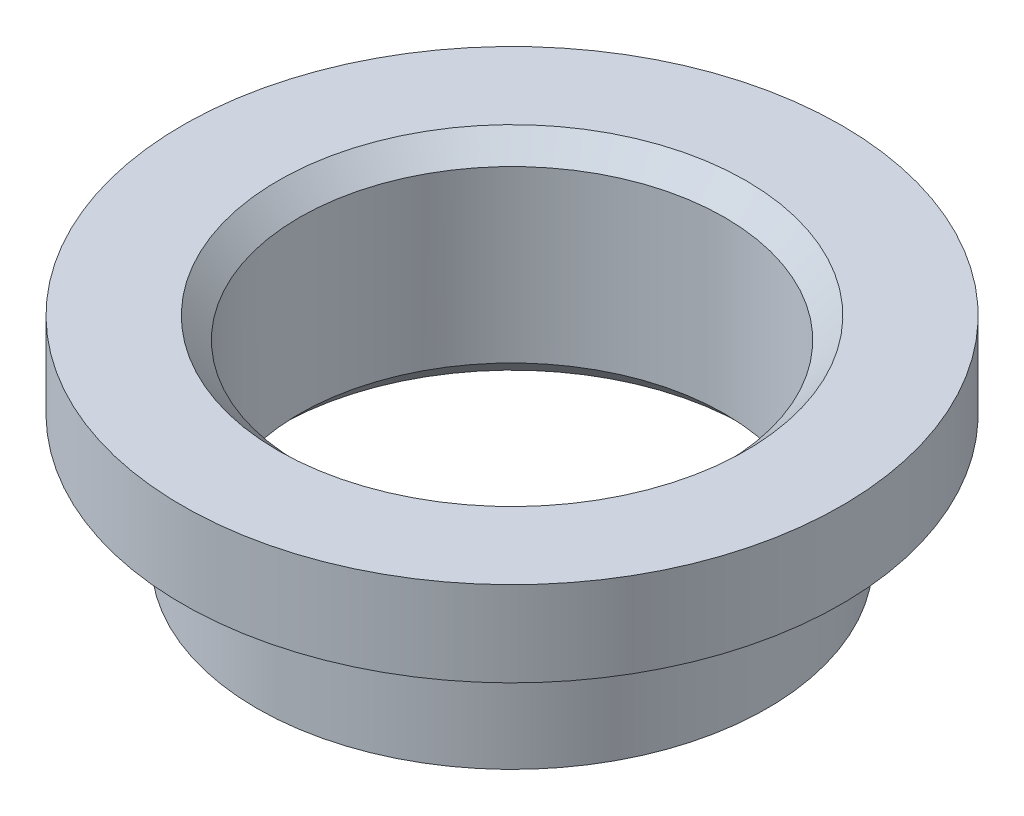
ISO-10303-21;
HEADER;
FILE_DESCRIPTION(('STEP AP214'),'2;1');
FILE_NAME('part.step','',(''),(''),'','','');
FILE_SCHEMA(('AUTOMOTIVE_DESIGN { 1 0 10303 214 1 1 1 1 }'));
ENDSEC;
DATA;
#1=APPLICATION_CONTEXT('core data for automotive mechanical design processes');
#2=APPLICATION_PROTOCOL_DEFINITION('international standard','automotive_design',2000,#1);
#3=PRODUCT_CONTEXT('',#1,'mechanical');
#4=PRODUCT('Part','Part','',(#3));
#5=PRODUCT_RELATED_PRODUCT_CATEGORY('part','',(#4));
#6=PRODUCT_DEFINITION_FORMATION('','',#4);
#7=PRODUCT_DEFINITION_CONTEXT('part definition',#1,'design');
#8=PRODUCT_DEFINITION('design','',#6,#7);
#9=PRODUCT_DEFINITION_SHAPE('','',#8);
#10=(LENGTH_UNIT() NAMED_UNIT(*) SI_UNIT(.MILLI.,.METRE.));
#11=(NAMED_UNIT(*) PLANE_ANGLE_UNIT() SI_UNIT($,.RADIAN.));
#12=(NAMED_UNIT(*) SI_UNIT($,.STERADIAN.) SOLID_ANGLE_UNIT());
#13=UNCERTAINTY_MEASURE_WITH_UNIT(LENGTH_MEASURE(1.E-05),#10,'distance_accuracy_value','');
#14=(GEOMETRIC_REPRESENTATION_CONTEXT(3) GLOBAL_UNCERTAINTY_ASSIGNED_CONTEXT((#13)) GLOBAL_UNIT_ASSIGNED_CONTEXT((#10,
#11,#12)) REPRESENTATION_CONTEXT('',''));
#15=CARTESIAN_POINT('',(0.,0.,0.));
#16=DIRECTION('',(0.,0.,1.));
#17=DIRECTION('',(1.,0.,0.));
#18=AXIS2_PLACEMENT_3D('',#15,#16,#17);
#19=CARTESIAN_POINT('',(0.,0.,0.));
#20=DIRECTION('',(0.,-1.,0.));
#21=DIRECTION('',(0.,0.,-1.));
#22=AXIS2_PLACEMENT_3D('',#19,#20,#21);
#23=CYLINDRICAL_SURFACE('',#22,6.);
#24=CARTESIAN_POINT('',(0.,-2.,0.));
#25=DIRECTION('',(0.,-1.,0.));
#26=DIRECTION('',(0.,0.,-1.));
#27=AXIS2_PLACEMENT_3D('',#24,#25,#26);
#28=CIRCLE('',#27,6.);
#29=CARTESIAN_POINT('',(0.,-2.,-6.));
#30=VERTEX_POINT('',#29);
#31=EDGE_CURVE('E72',#30,#30,#28,.T.);
#32=ORIENTED_EDGE('',*,*,#31,.T.);
#33=EDGE_LOOP('',(#32));
#34=FACE_BOUND('',#33,.T.);
#35=CARTESIAN_POINT('',(0.,-5.,0.));
#36=DIRECTION('',(0.,-1.,0.));
#37=DIRECTION('',(0.,0.,-1.));
#38=AXIS2_PLACEMENT_3D('',#35,#36,#37);
#39=CIRCLE('',#38,6.);
#40=CARTESIAN_POINT('',(0.,-5.,-6.));
#41=VERTEX_POINT('',#40);
#42=EDGE_CURVE('E65',#41,#41,#39,.T.);
#43=ORIENTED_EDGE('',*,*,#42,.F.);
#44=EDGE_LOOP('',(#43));
#45=FACE_BOUND('',#44,.T.);
#46=ADVANCED_FACE('F41',(#34,#45),#23,.T.);
#47=CARTESIAN_POINT('',(5.,-5.,0.));
#48=DIRECTION('',(0.,-1.,0.));
#49=DIRECTION('',(0.,0.,-1.));
#50=AXIS2_PLACEMENT_3D('',#47,#48,#49);
#51=PLANE('',#50);
#52=CARTESIAN_POINT('',(0.,-5.,0.));
#53=DIRECTION('',(0.,-1.,0.));
#54=DIRECTION('',(0.,0.,-1.));
#55=AXIS2_PLACEMENT_3D('',#52,#53,#54);
#56=CIRCLE('',#55,5.5);
#57=CARTESIAN_POINT('',(0.,-5.,-5.5));
#58=VERTEX_POINT('',#57);
#59=EDGE_CURVE('E47',#58,#58,#56,.F.);
#60=ORIENTED_EDGE('',*,*,#59,.T.);
#61=EDGE_LOOP('',(#60));
#62=FACE_BOUND('',#61,.T.);
#63=ORIENTED_EDGE('',*,*,#42,.T.);
#64=EDGE_LOOP('',(#63));
#65=FACE_BOUND('',#64,.T.);
#66=ADVANCED_FACE('F91',(#62,#65),#51,.T.);
#67=CARTESIAN_POINT('',(0.,0.,0.));
#68=DIRECTION('',(0.,-1.,0.));
#69=DIRECTION('',(0.,0.,-1.));
#70=AXIS2_PLACEMENT_3D('',#67,#68,#69);
#71=CYLINDRICAL_SURFACE('',#70,5.);
#72=CARTESIAN_POINT('',(0.,-4.5,0.));
#73=DIRECTION('',(0.,-1.,0.));
#74=DIRECTION('',(0.,0.,-1.));
#75=AXIS2_PLACEMENT_3D('',#72,#73,#74);
#76=CIRCLE('',#75,5.);
#77=CARTESIAN_POINT('',(0.,-4.5,-5.));
#78=VERTEX_POINT('',#77);
#79=EDGE_CURVE('E52',#78,#78,#76,.T.);
#80=ORIENTED_EDGE('',*,*,#79,.T.);
#81=EDGE_LOOP('',(#80));
#82=FACE_BOUND('',#81,.T.);
#83=CARTESIAN_POINT('',(0.,-0.499999999999997,0.));
#84=DIRECTION('',(0.,1.,0.));
#85=DIRECTION('',(0.,0.,1.));
#86=AXIS2_PLACEMENT_3D('',#83,#84,#85);
#87=CIRCLE('',#86,5.);
#88=CARTESIAN_POINT('',(0.,-0.499999999999997,5.));
#89=VERTEX_POINT('',#88);
#90=EDGE_CURVE('E60',#89,#89,#87,.T.);
#91=ORIENTED_EDGE('',*,*,#90,.T.);
#92=EDGE_LOOP('',(#91));
#93=FACE_BOUND('',#92,.T.);
#94=ADVANCED_FACE('F100',(#82,#93),#71,.F.);
#95=CARTESIAN_POINT('',(7.75,0.,0.));
#96=DIRECTION('',(0.,1.,0.));
#97=DIRECTION('',(0.,0.,1.));
#98=AXIS2_PLACEMENT_3D('',#95,#96,#97);
#99=PLANE('',#98);
#100=CARTESIAN_POINT('',(0.,0.,0.));
#101=DIRECTION('',(0.,1.,0.));
#102=DIRECTION('',(0.,0.,1.));
#103=AXIS2_PLACEMENT_3D('',#100,#101,#102);
#104=CIRCLE('',#103,5.49999999999999);
#105=CARTESIAN_POINT('',(0.,0.,5.49999999999999));
#106=VERTEX_POINT('',#105);
#107=EDGE_CURVE('E10',#106,#106,#104,.F.);
#108=ORIENTED_EDGE('',*,*,#107,.T.);
#109=EDGE_LOOP('',(#108));
#110=FACE_BOUND('',#109,.T.);
#111=CARTESIAN_POINT('',(0.,0.,0.));
#112=DIRECTION('',(0.,-1.,0.));
#113=DIRECTION('',(0.,0.,-1.));
#114=AXIS2_PLACEMENT_3D('',#111,#112,#113);
#115=CIRCLE('',#114,7.75);
#116=CARTESIAN_POINT('',(0.,0.,-7.75));
#117=VERTEX_POINT('',#116);
#118=EDGE_CURVE('E63',#117,#117,#115,.T.);
#119=ORIENTED_EDGE('',*,*,#118,.F.);
#120=EDGE_LOOP('',(#119));
#121=FACE_BOUND('',#120,.T.);
#122=ADVANCED_FACE('F90',(#110,#121),#99,.T.);
#123=CARTESIAN_POINT('',(0.,0.,0.));
#124=DIRECTION('',(0.,-1.,0.));
#125=DIRECTION('',(0.,0.,-1.));
#126=AXIS2_PLACEMENT_3D('',#123,#124,#125);
#127=CYLINDRICAL_SURFACE('',#126,7.75);
#128=ORIENTED_EDGE('',*,*,#118,.T.);
#129=EDGE_LOOP('',(#128));
#130=FACE_BOUND('',#129,.T.);
#131=CARTESIAN_POINT('',(0.,-2.,0.));
#132=DIRECTION('',(0.,-1.,0.));
#133=DIRECTION('',(0.,0.,-1.));
#134=AXIS2_PLACEMENT_3D('',#131,#132,#133);
#135=CIRCLE('',#134,7.75);
#136=CARTESIAN_POINT('',(0.,-2.,-7.75));
#137=VERTEX_POINT('',#136);
#138=EDGE_CURVE('E69',#137,#137,#135,.T.);
#139=ORIENTED_EDGE('',*,*,#138,.F.);
#140=EDGE_LOOP('',(#139));
#141=FACE_BOUND('',#140,.T.);
#142=ADVANCED_FACE('F78',(#130,#141),#127,.T.);
#143=CARTESIAN_POINT('',(6.,-2.,0.));
#144=DIRECTION('',(0.,-1.,0.));
#145=DIRECTION('',(0.,0.,-1.));
#146=AXIS2_PLACEMENT_3D('',#143,#144,#145);
#147=PLANE('',#146);
#148=ORIENTED_EDGE('',*,*,#138,.T.);
#149=EDGE_LOOP('',(#148));
#150=FACE_BOUND('',#149,.T.);
#151=ORIENTED_EDGE('',*,*,#31,.F.);
#152=EDGE_LOOP('',(#151));
#153=FACE_BOUND('',#152,.T.);
#154=ADVANCED_FACE('F80',(#150,#153),#147,.T.);
#155=CARTESIAN_POINT('',(0.,-4.5,0.));
#156=DIRECTION('',(0.,-1.,0.));
#157=DIRECTION('',(0.,0.,-1.));
#158=AXIS2_PLACEMENT_3D('',#155,#156,#157);
#159=CONICAL_SURFACE('',#158,5.,0.785398163397448);
#160=ORIENTED_EDGE('',*,*,#59,.F.);
#161=EDGE_LOOP('',(#160));
#162=FACE_BOUND('',#161,.T.);
#163=ORIENTED_EDGE('',*,*,#79,.F.);
#164=EDGE_LOOP('',(#163));
#165=FACE_BOUND('',#164,.T.);
#166=ADVANCED_FACE('F76',(#162,#165),#159,.F.);
#167=CARTESIAN_POINT('',(0.,0.,0.));
#168=DIRECTION('',(0.,1.,0.));
#169=DIRECTION('',(0.,0.,1.));
#170=AXIS2_PLACEMENT_3D('',#167,#168,#169);
#171=CONICAL_SURFACE('',#170,5.49999999999999,0.785398163397448);
#172=ORIENTED_EDGE('',*,*,#90,.F.);
#173=EDGE_LOOP('',(#172));
#174=FACE_BOUND('',#173,.T.);
#175=ORIENTED_EDGE('',*,*,#107,.F.);
#176=EDGE_LOOP('',(#175));
#177=FACE_BOUND('',#176,.T.);
#178=ADVANCED_FACE('F42',(#174,#177),#171,.F.);
#179=CLOSED_SHELL('',(#46,#66,#94,#122,#142,#154,#166,#178));
#180=MANIFOLD_SOLID_BREP('B2',#179);
#181=ADVANCED_BREP_SHAPE_REPRESENTATION('',(#18,#180),#14);
#182=SHAPE_DEFINITION_REPRESENTATION(#9,#181);
ENDSEC;
END-ISO-10303-21;
